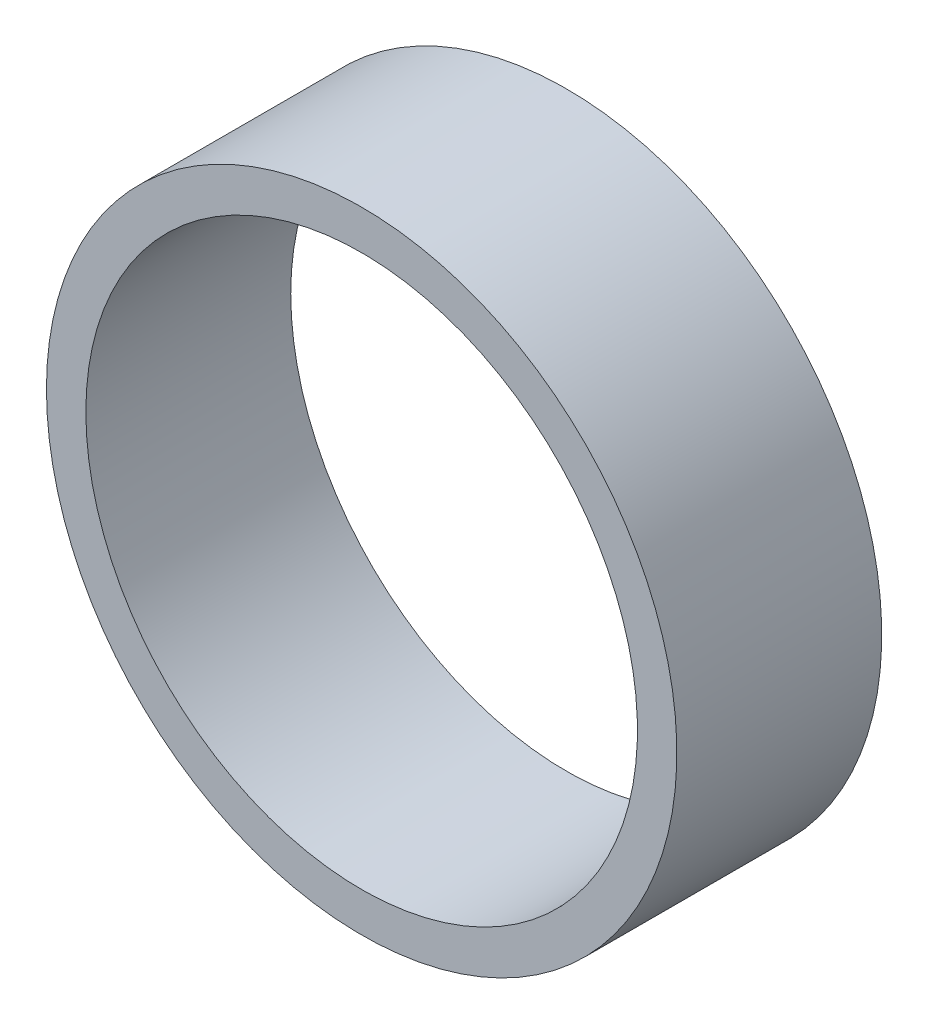
ISO-10303-21;
HEADER;
FILE_DESCRIPTION(('STEP AP214'),'2;1');
FILE_NAME('part.step','',(''),(''),'','','');
FILE_SCHEMA(('AUTOMOTIVE_DESIGN { 1 0 10303 214 1 1 1 1 }'));
ENDSEC;
DATA;
#1=APPLICATION_CONTEXT('core data for automotive mechanical design processes');
#2=APPLICATION_PROTOCOL_DEFINITION('international standard','automotive_design',2000,#1);
#3=PRODUCT_CONTEXT('',#1,'mechanical');
#4=PRODUCT('Part','Part','',(#3));
#5=PRODUCT_RELATED_PRODUCT_CATEGORY('part','',(#4));
#6=PRODUCT_DEFINITION_FORMATION('','',#4);
#7=PRODUCT_DEFINITION_CONTEXT('part definition',#1,'design');
#8=PRODUCT_DEFINITION('design','',#6,#7);
#9=PRODUCT_DEFINITION_SHAPE('','',#8);
#10=(LENGTH_UNIT() NAMED_UNIT(*) SI_UNIT(.MILLI.,.METRE.));
#11=(NAMED_UNIT(*) PLANE_ANGLE_UNIT() SI_UNIT($,.RADIAN.));
#12=(NAMED_UNIT(*) SI_UNIT($,.STERADIAN.) SOLID_ANGLE_UNIT());
#13=UNCERTAINTY_MEASURE_WITH_UNIT(LENGTH_MEASURE(1.E-05),#10,'distance_accuracy_value','');
#14=(GEOMETRIC_REPRESENTATION_CONTEXT(3) GLOBAL_UNCERTAINTY_ASSIGNED_CONTEXT((#13)) GLOBAL_UNIT_ASSIGNED_CONTEXT((#10,
#11,#12)) REPRESENTATION_CONTEXT('',''));
#15=CARTESIAN_POINT('',(0.,0.,0.));
#16=DIRECTION('',(0.,0.,1.));
#17=DIRECTION('',(1.,0.,0.));
#18=AXIS2_PLACEMENT_3D('',#15,#16,#17);
#19=CARTESIAN_POINT('',(0.,0.,13.));
#20=DIRECTION('',(0.,0.,1.));
#21=DIRECTION('',(1.,0.,0.));
#22=AXIS2_PLACEMENT_3D('',#19,#20,#21);
#23=PLANE('',#22);
#24=CARTESIAN_POINT('',(0.,0.,13.));
#25=DIRECTION('',(0.,0.,1.));
#26=DIRECTION('',(1.,0.,0.));
#27=AXIS2_PLACEMENT_3D('',#24,#25,#26);
#28=CIRCLE('',#27,20.);
#29=CARTESIAN_POINT('',(-20.,0.,13.));
#30=VERTEX_POINT('',#29);
#31=EDGE_CURVE('E10',#30,#30,#28,.T.);
#32=ORIENTED_EDGE('',*,*,#31,.T.);
#33=EDGE_LOOP('',(#32));
#34=FACE_BOUND('',#33,.T.);
#35=CARTESIAN_POINT('',(0.,0.,13.));
#36=DIRECTION('',(0.,0.,1.));
#37=DIRECTION('',(1.,0.,0.));
#38=AXIS2_PLACEMENT_3D('',#35,#36,#37);
#39=CIRCLE('',#38,17.5);
#40=CARTESIAN_POINT('',(-17.5,0.,13.));
#41=VERTEX_POINT('',#40);
#42=EDGE_CURVE('E45',#41,#41,#39,.T.);
#43=ORIENTED_EDGE('',*,*,#42,.F.);
#44=EDGE_LOOP('',(#43));
#45=FACE_BOUND('',#44,.T.);
#46=ADVANCED_FACE('F34',(#34,#45),#23,.T.);
#47=CARTESIAN_POINT('',(0.,0.,0.));
#48=DIRECTION('',(0.,0.,1.));
#49=DIRECTION('',(1.,0.,0.));
#50=AXIS2_PLACEMENT_3D('',#47,#48,#49);
#51=PLANE('',#50);
#52=CARTESIAN_POINT('',(0.,0.,0.));
#53=DIRECTION('',(0.,0.,1.));
#54=DIRECTION('',(1.,0.,0.));
#55=AXIS2_PLACEMENT_3D('',#52,#53,#54);
#56=CIRCLE('',#55,20.);
#57=CARTESIAN_POINT('',(-20.,0.,0.));
#58=VERTEX_POINT('',#57);
#59=EDGE_CURVE('E38',#58,#58,#56,.T.);
#60=ORIENTED_EDGE('',*,*,#59,.F.);
#61=EDGE_LOOP('',(#60));
#62=FACE_BOUND('',#61,.T.);
#63=CARTESIAN_POINT('',(0.,0.,0.));
#64=DIRECTION('',(0.,0.,1.));
#65=DIRECTION('',(1.,0.,0.));
#66=AXIS2_PLACEMENT_3D('',#63,#64,#65);
#67=CIRCLE('',#66,17.5);
#68=CARTESIAN_POINT('',(-17.5,0.,0.));
#69=VERTEX_POINT('',#68);
#70=EDGE_CURVE('E47',#69,#69,#67,.T.);
#71=ORIENTED_EDGE('',*,*,#70,.T.);
#72=EDGE_LOOP('',(#71));
#73=FACE_BOUND('',#72,.T.);
#74=ADVANCED_FACE('F57',(#62,#73),#51,.F.);
#75=CARTESIAN_POINT('',(0.,0.,13.));
#76=DIRECTION('',(0.,0.,-1.));
#77=DIRECTION('',(-1.,0.,0.));
#78=AXIS2_PLACEMENT_3D('',#75,#76,#77);
#79=CYLINDRICAL_SURFACE('',#78,20.);
#80=CARTESIAN_POINT('',(-20.,0.,13.));
#81=CARTESIAN_POINT('',(-20.,0.,12.8645833333333));
#82=CARTESIAN_POINT('',(-20.,0.,12.7291666666667));
#83=CARTESIAN_POINT('',(-20.,0.,12.4583333333333));
#84=CARTESIAN_POINT('',(-20.,0.,12.3229166666667));
#85=CARTESIAN_POINT('',(-20.,0.,12.0520833333333));
#86=CARTESIAN_POINT('',(-20.,0.,11.9166666666667));
#87=CARTESIAN_POINT('',(-20.,0.,11.6458333333333));
#88=CARTESIAN_POINT('',(-20.,0.,11.5104166666667));
#89=CARTESIAN_POINT('',(-20.,0.,11.2395833333333));
#90=CARTESIAN_POINT('',(-20.,0.,11.1041666666667));
#91=CARTESIAN_POINT('',(-20.,0.,10.8333333333333));
#92=CARTESIAN_POINT('',(-20.,0.,10.6979166666667));
#93=CARTESIAN_POINT('',(-20.,0.,10.4270833333333));
#94=CARTESIAN_POINT('',(-20.,0.,10.2916666666667));
#95=CARTESIAN_POINT('',(-20.,0.,10.0208333333333));
#96=CARTESIAN_POINT('',(-20.,0.,9.88541666666667));
#97=CARTESIAN_POINT('',(-20.,0.,9.61458333333333));
#98=CARTESIAN_POINT('',(-20.,0.,9.47916666666667));
#99=CARTESIAN_POINT('',(-20.,0.,9.20833333333333));
#100=CARTESIAN_POINT('',(-20.,0.,9.07291666666666));
#101=CARTESIAN_POINT('',(-20.,0.,8.80208333333333));
#102=CARTESIAN_POINT('',(-20.,0.,8.66666666666667));
#103=CARTESIAN_POINT('',(-20.,0.,8.39583333333333));
#104=CARTESIAN_POINT('',(-20.,0.,8.26041666666667));
#105=CARTESIAN_POINT('',(-20.,0.,7.98958333333333));
#106=CARTESIAN_POINT('',(-20.,0.,7.85416666666667));
#107=CARTESIAN_POINT('',(-20.,0.,7.58333333333333));
#108=CARTESIAN_POINT('',(-20.,0.,7.44791666666667));
#109=CARTESIAN_POINT('',(-20.,0.,7.17708333333333));
#110=CARTESIAN_POINT('',(-20.,0.,7.04166666666667));
#111=CARTESIAN_POINT('',(-20.,0.,6.77083333333333));
#112=CARTESIAN_POINT('',(-20.,0.,6.63541666666667));
#113=CARTESIAN_POINT('',(-20.,0.,6.36458333333333));
#114=CARTESIAN_POINT('',(-20.,0.,6.22916666666667));
#115=CARTESIAN_POINT('',(-20.,0.,5.95833333333333));
#116=CARTESIAN_POINT('',(-20.,0.,5.82291666666667));
#117=CARTESIAN_POINT('',(-20.,0.,5.55208333333333));
#118=CARTESIAN_POINT('',(-20.,0.,5.41666666666667));
#119=CARTESIAN_POINT('',(-20.,0.,5.14583333333333));
#120=CARTESIAN_POINT('',(-20.,0.,5.01041666666667));
#121=CARTESIAN_POINT('',(-20.,0.,4.73958333333333));
#122=CARTESIAN_POINT('',(-20.,0.,4.60416666666667));
#123=CARTESIAN_POINT('',(-20.,0.,4.33333333333333));
#124=CARTESIAN_POINT('',(-20.,0.,4.19791666666667));
#125=CARTESIAN_POINT('',(-20.,0.,3.92708333333333));
#126=CARTESIAN_POINT('',(-20.,0.,3.79166666666667));
#127=CARTESIAN_POINT('',(-20.,0.,3.52083333333333));
#128=CARTESIAN_POINT('',(-20.,0.,3.38541666666667));
#129=CARTESIAN_POINT('',(-20.,0.,3.11458333333333));
#130=CARTESIAN_POINT('',(-20.,0.,2.97916666666667));
#131=CARTESIAN_POINT('',(-20.,0.,2.70833333333333));
#132=CARTESIAN_POINT('',(-20.,0.,2.57291666666667));
#133=CARTESIAN_POINT('',(-20.,0.,2.30208333333333));
#134=CARTESIAN_POINT('',(-20.,0.,2.16666666666667));
#135=CARTESIAN_POINT('',(-20.,0.,1.89583333333333));
#136=CARTESIAN_POINT('',(-20.,0.,1.76041666666667));
#137=CARTESIAN_POINT('',(-20.,0.,1.48958333333333));
#138=CARTESIAN_POINT('',(-20.,0.,1.35416666666667));
#139=CARTESIAN_POINT('',(-20.,0.,1.08333333333333));
#140=CARTESIAN_POINT('',(-20.,0.,0.947916666666667));
#141=CARTESIAN_POINT('',(-20.,0.,0.677083333333334));
#142=CARTESIAN_POINT('',(-20.,0.,0.541666666666667));
#143=CARTESIAN_POINT('',(-20.,0.,0.270833333333334));
#144=CARTESIAN_POINT('',(-20.,0.,0.135416666666667));
#145=CARTESIAN_POINT('',(-20.,0.,0.));
#146=B_SPLINE_CURVE_WITH_KNOTS('',3,(#80,#81,#82,#83,#84,#85,#86,#87,#88,#89,#90,#91,#92,#93,
#94,#95,#96,#97,#98,#99,#100,#101,#102,#103,#104,#105,#106,#107,#108,#109,#110,#111,#112,#113,
#114,#115,#116,#117,#118,#119,#120,#121,#122,#123,#124,#125,#126,#127,#128,#129,#130,#131,#132,
#133,#134,#135,#136,#137,#138,#139,#140,#141,#142,#143,#144,#145),.UNSPECIFIED.,.F.,.F.,(4,2,2,
2,2,2,2,2,2,2,2,2,2,2,2,2,2,2,2,2,2,2,2,2,2,2,2,2,2,2,2,2,4),(0.,0.40625,0.812500000000001,
1.21875,1.625,2.03125,2.4375,2.84375,3.25,3.65625,4.0625,4.46875,4.875,5.28125,5.6875,6.09375,
6.5,6.90625,7.3125,7.71875,8.125,8.53125,8.9375,9.34375,9.75,10.15625,10.5625,10.96875,11.375,
11.78125,12.1875,12.59375,13.),.UNSPECIFIED.);
#147=EDGE_CURVE('BSEAM36',#30,#58,#146,.T.);
#148=ORIENTED_EDGE('',*,*,#31,.F.);
#149=ORIENTED_EDGE('',*,*,#59,.T.);
#150=ORIENTED_EDGE('',*,*,#147,.T.);
#151=ORIENTED_EDGE('',*,*,#147,.F.);
#152=EDGE_LOOP('',(#148,#150,#149,#151));
#153=FACE_BOUND('',#152,.T.);
#154=ADVANCED_FACE('F36',(#153),#79,.T.);
#155=CARTESIAN_POINT('',(0.,0.,13.));
#156=DIRECTION('',(0.,0.,-1.));
#157=DIRECTION('',(-1.,0.,0.));
#158=AXIS2_PLACEMENT_3D('',#155,#156,#157);
#159=CYLINDRICAL_SURFACE('',#158,17.5);
#160=CARTESIAN_POINT('',(-17.5,0.,13.));
#161=CARTESIAN_POINT('',(-17.5,0.,12.8645833333333));
#162=CARTESIAN_POINT('',(-17.5,0.,12.7291666666667));
#163=CARTESIAN_POINT('',(-17.5,0.,12.4583333333333));
#164=CARTESIAN_POINT('',(-17.5,0.,12.3229166666667));
#165=CARTESIAN_POINT('',(-17.5,0.,12.0520833333333));
#166=CARTESIAN_POINT('',(-17.5,0.,11.9166666666667));
#167=CARTESIAN_POINT('',(-17.5,0.,11.6458333333333));
#168=CARTESIAN_POINT('',(-17.5,0.,11.5104166666667));
#169=CARTESIAN_POINT('',(-17.5,0.,11.2395833333333));
#170=CARTESIAN_POINT('',(-17.5,0.,11.1041666666667));
#171=CARTESIAN_POINT('',(-17.5,0.,10.8333333333333));
#172=CARTESIAN_POINT('',(-17.5,0.,10.6979166666667));
#173=CARTESIAN_POINT('',(-17.5,0.,10.4270833333333));
#174=CARTESIAN_POINT('',(-17.5,0.,10.2916666666667));
#175=CARTESIAN_POINT('',(-17.5,0.,10.0208333333333));
#176=CARTESIAN_POINT('',(-17.5,0.,9.88541666666667));
#177=CARTESIAN_POINT('',(-17.5,0.,9.61458333333333));
#178=CARTESIAN_POINT('',(-17.5,0.,9.47916666666667));
#179=CARTESIAN_POINT('',(-17.5,0.,9.20833333333333));
#180=CARTESIAN_POINT('',(-17.5,0.,9.07291666666667));
#181=CARTESIAN_POINT('',(-17.5,0.,8.80208333333333));
#182=CARTESIAN_POINT('',(-17.5,0.,8.66666666666667));
#183=CARTESIAN_POINT('',(-17.5,0.,8.39583333333333));
#184=CARTESIAN_POINT('',(-17.5,0.,8.26041666666667));
#185=CARTESIAN_POINT('',(-17.5,0.,7.98958333333333));
#186=CARTESIAN_POINT('',(-17.5,0.,7.85416666666667));
#187=CARTESIAN_POINT('',(-17.5,0.,7.58333333333333));
#188=CARTESIAN_POINT('',(-17.5,0.,7.44791666666667));
#189=CARTESIAN_POINT('',(-17.5,0.,7.17708333333333));
#190=CARTESIAN_POINT('',(-17.5,0.,7.04166666666667));
#191=CARTESIAN_POINT('',(-17.5,0.,6.77083333333333));
#192=CARTESIAN_POINT('',(-17.5,0.,6.63541666666667));
#193=CARTESIAN_POINT('',(-17.5,0.,6.36458333333333));
#194=CARTESIAN_POINT('',(-17.5,0.,6.22916666666667));
#195=CARTESIAN_POINT('',(-17.5,0.,5.95833333333333));
#196=CARTESIAN_POINT('',(-17.5,0.,5.82291666666667));
#197=CARTESIAN_POINT('',(-17.5,0.,5.55208333333333));
#198=CARTESIAN_POINT('',(-17.5,0.,5.41666666666667));
#199=CARTESIAN_POINT('',(-17.5,0.,5.14583333333333));
#200=CARTESIAN_POINT('',(-17.5,0.,5.01041666666667));
#201=CARTESIAN_POINT('',(-17.5,0.,4.73958333333333));
#202=CARTESIAN_POINT('',(-17.5,0.,4.60416666666667));
#203=CARTESIAN_POINT('',(-17.5,0.,4.33333333333333));
#204=CARTESIAN_POINT('',(-17.5,0.,4.19791666666667));
#205=CARTESIAN_POINT('',(-17.5,0.,3.92708333333333));
#206=CARTESIAN_POINT('',(-17.5,0.,3.79166666666667));
#207=CARTESIAN_POINT('',(-17.5,0.,3.52083333333333));
#208=CARTESIAN_POINT('',(-17.5,0.,3.38541666666667));
#209=CARTESIAN_POINT('',(-17.5,0.,3.11458333333333));
#210=CARTESIAN_POINT('',(-17.5,0.,2.97916666666667));
#211=CARTESIAN_POINT('',(-17.5,0.,2.70833333333333));
#212=CARTESIAN_POINT('',(-17.5,0.,2.57291666666667));
#213=CARTESIAN_POINT('',(-17.5,0.,2.30208333333333));
#214=CARTESIAN_POINT('',(-17.5,0.,2.16666666666667));
#215=CARTESIAN_POINT('',(-17.5,0.,1.89583333333333));
#216=CARTESIAN_POINT('',(-17.5,0.,1.76041666666667));
#217=CARTESIAN_POINT('',(-17.5,0.,1.48958333333333));
#218=CARTESIAN_POINT('',(-17.5,0.,1.35416666666667));
#219=CARTESIAN_POINT('',(-17.5,0.,1.08333333333333));
#220=CARTESIAN_POINT('',(-17.5,0.,0.947916666666667));
#221=CARTESIAN_POINT('',(-17.5,0.,0.677083333333334));
#222=CARTESIAN_POINT('',(-17.5,0.,0.541666666666667));
#223=CARTESIAN_POINT('',(-17.5,0.,0.270833333333334));
#224=CARTESIAN_POINT('',(-17.5,0.,0.135416666666667));
#225=CARTESIAN_POINT('',(-17.5,0.,0.));
#226=B_SPLINE_CURVE_WITH_KNOTS('',3,(#160,#161,#162,#163,#164,#165,#166,#167,#168,#169,#170,
#171,#172,#173,#174,#175,#176,#177,#178,#179,#180,#181,#182,#183,#184,#185,#186,#187,#188,#189,
#190,#191,#192,#193,#194,#195,#196,#197,#198,#199,#200,#201,#202,#203,#204,#205,#206,#207,#208,
#209,#210,#211,#212,#213,#214,#215,#216,#217,#218,#219,#220,#221,#222,#223,#224,#225),
.UNSPECIFIED.,.F.,.F.,(4,2,2,2,2,2,2,2,2,2,2,2,2,2,2,2,2,2,2,2,2,2,2,2,2,2,2,2,2,2,2,2,4),(0.,
0.406249999999999,0.812499999999999,1.21875,1.625,2.03125,2.4375,2.84375,3.25,3.65625,4.0625,
4.46875,4.875,5.28125,5.6875,6.09375,6.5,6.90625,7.3125,7.71875,8.125,8.53125,8.9375,9.34375,
9.75,10.15625,10.5625,10.96875,11.375,11.78125,12.1875,12.59375,13.),.UNSPECIFIED.);
#227=EDGE_CURVE('BSEAM53',#41,#69,#226,.T.);
#228=ORIENTED_EDGE('',*,*,#42,.T.);
#229=ORIENTED_EDGE('',*,*,#70,.F.);
#230=ORIENTED_EDGE('',*,*,#227,.T.);
#231=ORIENTED_EDGE('',*,*,#227,.F.);
#232=EDGE_LOOP('',(#228,#230,#229,#231));
#233=FACE_BOUND('',#232,.T.);
#234=ADVANCED_FACE('F53',(#233),#159,.F.);
#235=CLOSED_SHELL('',(#46,#74,#154,#234));
#236=MANIFOLD_SOLID_BREP('B2',#235);
#237=ADVANCED_BREP_SHAPE_REPRESENTATION('',(#18,#236),#14);
#238=SHAPE_DEFINITION_REPRESENTATION(#9,#237);
ENDSEC;
END-ISO-10303-21;
